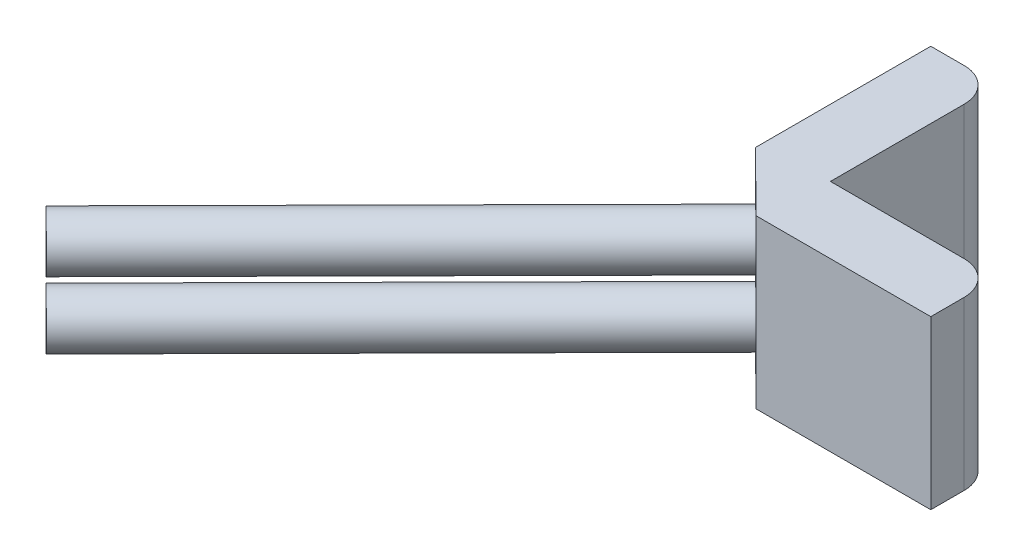
ISO-10303-21;
HEADER;
FILE_DESCRIPTION(('STEP AP214'),'2;1');
FILE_NAME('part.step','',(''),(''),'','','');
FILE_SCHEMA(('AUTOMOTIVE_DESIGN { 1 0 10303 214 1 1 1 1 }'));
ENDSEC;
DATA;
#1=APPLICATION_CONTEXT('core data for automotive mechanical design processes');
#2=APPLICATION_PROTOCOL_DEFINITION('international standard','automotive_design',2000,#1);
#3=PRODUCT_CONTEXT('',#1,'mechanical');
#4=PRODUCT('Part','Part','',(#3));
#5=PRODUCT_RELATED_PRODUCT_CATEGORY('part','',(#4));
#6=PRODUCT_DEFINITION_FORMATION('','',#4);
#7=PRODUCT_DEFINITION_CONTEXT('part definition',#1,'design');
#8=PRODUCT_DEFINITION('design','',#6,#7);
#9=PRODUCT_DEFINITION_SHAPE('','',#8);
#10=(LENGTH_UNIT() NAMED_UNIT(*) SI_UNIT(.MILLI.,.METRE.));
#11=(NAMED_UNIT(*) PLANE_ANGLE_UNIT() SI_UNIT($,.RADIAN.));
#12=(NAMED_UNIT(*) SI_UNIT($,.STERADIAN.) SOLID_ANGLE_UNIT());
#13=UNCERTAINTY_MEASURE_WITH_UNIT(LENGTH_MEASURE(1.E-05),#10,'distance_accuracy_value','');
#14=(GEOMETRIC_REPRESENTATION_CONTEXT(3) GLOBAL_UNCERTAINTY_ASSIGNED_CONTEXT((#13)) GLOBAL_UNIT_ASSIGNED_CONTEXT((#10,
#11,#12)) REPRESENTATION_CONTEXT('',''));
#15=CARTESIAN_POINT('',(0.,0.,0.));
#16=DIRECTION('',(0.,0.,1.));
#17=DIRECTION('',(1.,0.,0.));
#18=AXIS2_PLACEMENT_3D('',#15,#16,#17);
#19=CARTESIAN_POINT('',(70.,50.,0.));
#20=DIRECTION('',(0.,0.,-1.));
#21=DIRECTION('',(-1.,0.,0.));
#22=AXIS2_PLACEMENT_3D('',#19,#20,#21);
#23=PLANE('',#22);
#24=DIRECTION('',(1.,0.,0.));
#25=VECTOR('',#24,1.);
#26=CARTESIAN_POINT('',(70.,50.,0.));
#27=LINE('',#26,#25);
#28=CARTESIAN_POINT('',(17.7549992959729,50.,0.));
#29=VERTEX_POINT('',#28);
#30=CARTESIAN_POINT('',(70.,50.,0.));
#31=VERTEX_POINT('',#30);
#32=EDGE_CURVE('E135',#29,#31,#27,.T.);
#33=ORIENTED_EDGE('',*,*,#32,.F.);
#34=DIRECTION('',(0.,1.,0.));
#35=VECTOR('',#34,1.);
#36=CARTESIAN_POINT('',(17.7549992959729,0.,0.));
#37=LINE('',#36,#35);
#38=CARTESIAN_POINT('',(17.7549992959729,0.,0.));
#39=VERTEX_POINT('',#38);
#40=EDGE_CURVE('E119',#39,#29,#37,.T.);
#41=ORIENTED_EDGE('',*,*,#40,.F.);
#42=DIRECTION('',(1.,0.,0.));
#43=VECTOR('',#42,1.);
#44=CARTESIAN_POINT('',(70.,0.,0.));
#45=LINE('',#44,#43);
#46=CARTESIAN_POINT('',(70.,0.,0.));
#47=VERTEX_POINT('',#46);
#48=EDGE_CURVE('E133',#39,#47,#45,.T.);
#49=ORIENTED_EDGE('',*,*,#48,.T.);
#50=DIRECTION('',(0.,-1.,0.));
#51=VECTOR('',#50,1.);
#52=CARTESIAN_POINT('',(70.,50.,0.));
#53=LINE('',#52,#51);
#54=EDGE_CURVE('E173',#31,#47,#53,.T.);
#55=ORIENTED_EDGE('',*,*,#54,.F.);
#56=EDGE_LOOP('',(#33,#41,#49,#55));
#57=FACE_BOUND('',#56,.T.);
#58=ADVANCED_FACE('F45',(#57),#23,.F.);
#59=CARTESIAN_POINT('',(70.,50.,-20.));
#60=DIRECTION('',(-1.,0.,0.));
#61=DIRECTION('',(0.,0.,1.));
#62=AXIS2_PLACEMENT_3D('',#59,#60,#61);
#63=PLANE('',#62);
#64=DIRECTION('',(0.,0.,-1.));
#65=VECTOR('',#64,1.);
#66=CARTESIAN_POINT('',(70.,0.,-20.));
#67=LINE('',#66,#65);
#68=CARTESIAN_POINT('',(70.,0.,-10.));
#69=VERTEX_POINT('',#68);
#70=EDGE_CURVE('E140',#47,#69,#67,.T.);
#71=ORIENTED_EDGE('',*,*,#70,.T.);
#72=DIRECTION('',(0.,-1.,0.));
#73=VECTOR('',#72,1.);
#74=CARTESIAN_POINT('',(70.,50.,-10.));
#75=LINE('',#74,#73);
#76=CARTESIAN_POINT('',(70.,50.,-10.));
#77=VERTEX_POINT('',#76);
#78=EDGE_CURVE('E11',#69,#77,#75,.F.);
#79=ORIENTED_EDGE('',*,*,#78,.T.);
#80=DIRECTION('',(0.,0.,-1.));
#81=VECTOR('',#80,1.);
#82=CARTESIAN_POINT('',(70.,50.,-20.));
#83=LINE('',#82,#81);
#84=EDGE_CURVE('E233',#31,#77,#83,.T.);
#85=ORIENTED_EDGE('',*,*,#84,.F.);
#86=ORIENTED_EDGE('',*,*,#54,.T.);
#87=EDGE_LOOP('',(#71,#79,#85,#86));
#88=FACE_BOUND('',#87,.T.);
#89=ADVANCED_FACE('F277',(#88),#63,.F.);
#90=CARTESIAN_POINT('',(20.,50.,-20.));
#91=DIRECTION('',(0.,0.,1.));
#92=DIRECTION('',(1.,0.,0.));
#93=AXIS2_PLACEMENT_3D('',#90,#91,#92);
#94=PLANE('',#93);
#95=DIRECTION('',(-1.,0.,0.));
#96=VECTOR('',#95,1.);
#97=CARTESIAN_POINT('',(20.,50.,-20.));
#98=LINE('',#97,#96);
#99=CARTESIAN_POINT('',(60.,50.,-20.));
#100=VERTEX_POINT('',#99);
#101=CARTESIAN_POINT('',(20.,50.,-20.));
#102=VERTEX_POINT('',#101);
#103=EDGE_CURVE('E205',#100,#102,#98,.T.);
#104=ORIENTED_EDGE('',*,*,#103,.F.);
#105=DIRECTION('',(0.,-1.,0.));
#106=VECTOR('',#105,1.);
#107=CARTESIAN_POINT('',(60.,50.,-20.));
#108=LINE('',#107,#106);
#109=CARTESIAN_POINT('',(60.,0.,-20.));
#110=VERTEX_POINT('',#109);
#111=EDGE_CURVE('E54',#100,#110,#108,.T.);
#112=ORIENTED_EDGE('',*,*,#111,.T.);
#113=DIRECTION('',(-1.,0.,0.));
#114=VECTOR('',#113,1.);
#115=CARTESIAN_POINT('',(20.,0.,-20.));
#116=LINE('',#115,#114);
#117=CARTESIAN_POINT('',(20.,0.,-20.));
#118=VERTEX_POINT('',#117);
#119=EDGE_CURVE('E146',#110,#118,#116,.T.);
#120=ORIENTED_EDGE('',*,*,#119,.T.);
#121=DIRECTION('',(0.,-1.,0.));
#122=VECTOR('',#121,1.);
#123=CARTESIAN_POINT('',(20.,50.,-20.));
#124=LINE('',#123,#122);
#125=EDGE_CURVE('E169',#102,#118,#124,.T.);
#126=ORIENTED_EDGE('',*,*,#125,.F.);
#127=EDGE_LOOP('',(#104,#112,#120,#126));
#128=FACE_BOUND('',#127,.T.);
#129=ADVANCED_FACE('F203',(#128),#94,.F.);
#130=CARTESIAN_POINT('',(20.,50.,-70.));
#131=DIRECTION('',(-1.,0.,0.));
#132=DIRECTION('',(0.,0.,1.));
#133=AXIS2_PLACEMENT_3D('',#130,#131,#132);
#134=PLANE('',#133);
#135=DIRECTION('',(0.,0.,-1.));
#136=VECTOR('',#135,1.);
#137=CARTESIAN_POINT('',(20.,0.,-70.));
#138=LINE('',#137,#136);
#139=CARTESIAN_POINT('',(20.,0.,-60.));
#140=VERTEX_POINT('',#139);
#141=EDGE_CURVE('E155',#118,#140,#138,.T.);
#142=ORIENTED_EDGE('',*,*,#141,.T.);
#143=DIRECTION('',(0.,-1.,0.));
#144=VECTOR('',#143,1.);
#145=CARTESIAN_POINT('',(20.,50.,-60.));
#146=LINE('',#145,#144);
#147=CARTESIAN_POINT('',(20.,50.,-60.));
#148=VERTEX_POINT('',#147);
#149=EDGE_CURVE('E191',#140,#148,#146,.F.);
#150=ORIENTED_EDGE('',*,*,#149,.T.);
#151=DIRECTION('',(0.,0.,-1.));
#152=VECTOR('',#151,1.);
#153=CARTESIAN_POINT('',(20.,50.,-70.));
#154=LINE('',#153,#152);
#155=EDGE_CURVE('E222',#102,#148,#154,.T.);
#156=ORIENTED_EDGE('',*,*,#155,.F.);
#157=ORIENTED_EDGE('',*,*,#125,.T.);
#158=EDGE_LOOP('',(#142,#150,#156,#157));
#159=FACE_BOUND('',#158,.T.);
#160=ADVANCED_FACE('F210',(#159),#134,.F.);
#161=CARTESIAN_POINT('',(0.,50.,-70.));
#162=DIRECTION('',(0.,0.,1.));
#163=DIRECTION('',(1.,0.,0.));
#164=AXIS2_PLACEMENT_3D('',#161,#162,#163);
#165=PLANE('',#164);
#166=DIRECTION('',(-1.,0.,0.));
#167=VECTOR('',#166,1.);
#168=CARTESIAN_POINT('',(0.,50.,-70.));
#169=LINE('',#168,#167);
#170=CARTESIAN_POINT('',(9.99999999999999,50.,-70.));
#171=VERTEX_POINT('',#170);
#172=CARTESIAN_POINT('',(0.,50.,-70.));
#173=VERTEX_POINT('',#172);
#174=EDGE_CURVE('E220',#171,#173,#169,.T.);
#175=ORIENTED_EDGE('',*,*,#174,.F.);
#176=DIRECTION('',(0.,-1.,0.));
#177=VECTOR('',#176,1.);
#178=CARTESIAN_POINT('',(9.99999999999999,50.,-70.));
#179=LINE('',#178,#177);
#180=CARTESIAN_POINT('',(9.99999999999999,0.,-70.));
#181=VERTEX_POINT('',#180);
#182=EDGE_CURVE('E181',#171,#181,#179,.T.);
#183=ORIENTED_EDGE('',*,*,#182,.T.);
#184=DIRECTION('',(-1.,0.,0.));
#185=VECTOR('',#184,1.);
#186=CARTESIAN_POINT('',(0.,0.,-70.));
#187=LINE('',#186,#185);
#188=CARTESIAN_POINT('',(0.,0.,-70.));
#189=VERTEX_POINT('',#188);
#190=EDGE_CURVE('E159',#181,#189,#187,.T.);
#191=ORIENTED_EDGE('',*,*,#190,.T.);
#192=DIRECTION('',(0.,-1.,0.));
#193=VECTOR('',#192,1.);
#194=CARTESIAN_POINT('',(0.,50.,-70.));
#195=LINE('',#194,#193);
#196=EDGE_CURVE('E165',#173,#189,#195,.T.);
#197=ORIENTED_EDGE('',*,*,#196,.F.);
#198=EDGE_LOOP('',(#175,#183,#191,#197));
#199=FACE_BOUND('',#198,.T.);
#200=ADVANCED_FACE('F224',(#199),#165,.F.);
#201=CARTESIAN_POINT('',(0.,50.,0.));
#202=DIRECTION('',(1.,0.,0.));
#203=DIRECTION('',(0.,0.,-1.));
#204=AXIS2_PLACEMENT_3D('',#201,#202,#203);
#205=PLANE('',#204);
#206=DIRECTION('',(0.,0.,1.));
#207=VECTOR('',#206,1.);
#208=CARTESIAN_POINT('',(0.,0.,0.));
#209=LINE('',#208,#207);
#210=CARTESIAN_POINT('',(0.,0.,-17.6));
#211=VERTEX_POINT('',#210);
#212=EDGE_CURVE('E162',#189,#211,#209,.T.);
#213=ORIENTED_EDGE('',*,*,#212,.T.);
#214=DIRECTION('',(0.,1.,0.));
#215=VECTOR('',#214,1.);
#216=CARTESIAN_POINT('',(0.,0.,-17.6));
#217=LINE('',#216,#215);
#218=CARTESIAN_POINT('',(0.,50.,-17.6));
#219=VERTEX_POINT('',#218);
#220=EDGE_CURVE('E122',#211,#219,#217,.T.);
#221=ORIENTED_EDGE('',*,*,#220,.T.);
#222=DIRECTION('',(0.,0.,1.));
#223=VECTOR('',#222,1.);
#224=CARTESIAN_POINT('',(0.,50.,0.));
#225=LINE('',#224,#223);
#226=EDGE_CURVE('E150',#173,#219,#225,.T.);
#227=ORIENTED_EDGE('',*,*,#226,.F.);
#228=ORIENTED_EDGE('',*,*,#196,.T.);
#229=EDGE_LOOP('',(#213,#221,#227,#228));
#230=FACE_BOUND('',#229,.T.);
#231=ADVANCED_FACE('F321',(#230),#205,.F.);
#232=CARTESIAN_POINT('',(0.,50.,0.));
#233=DIRECTION('',(0.,-1.,0.));
#234=DIRECTION('',(0.,0.,-1.));
#235=AXIS2_PLACEMENT_3D('',#232,#233,#234);
#236=PLANE('',#235);
#237=ORIENTED_EDGE('',*,*,#155,.T.);
#238=CARTESIAN_POINT('',(9.99999999999999,50.,-60.));
#239=DIRECTION('',(0.,-1.,0.));
#240=DIRECTION('',(0.,0.,-1.));
#241=AXIS2_PLACEMENT_3D('',#238,#239,#240);
#242=CIRCLE('',#241,10.);
#243=EDGE_CURVE('E196',#148,#171,#242,.F.);
#244=ORIENTED_EDGE('',*,*,#243,.T.);
#245=ORIENTED_EDGE('',*,*,#174,.T.);
#246=ORIENTED_EDGE('',*,*,#226,.T.);
#247=DIRECTION('',(-0.710199971838918,0.,-0.704));
#248=VECTOR('',#247,1.);
#249=CARTESIAN_POINT('',(0.,50.,-17.6));
#250=LINE('',#249,#248);
#251=EDGE_CURVE('E128',#29,#219,#250,.T.);
#252=ORIENTED_EDGE('',*,*,#251,.F.);
#253=ORIENTED_EDGE('',*,*,#32,.T.);
#254=ORIENTED_EDGE('',*,*,#84,.T.);
#255=CARTESIAN_POINT('',(60.,50.,-10.));
#256=DIRECTION('',(0.,-1.,0.));
#257=DIRECTION('',(0.,0.,-1.));
#258=AXIS2_PLACEMENT_3D('',#255,#256,#257);
#259=CIRCLE('',#258,10.);
#260=EDGE_CURVE('E61',#77,#100,#259,.F.);
#261=ORIENTED_EDGE('',*,*,#260,.T.);
#262=ORIENTED_EDGE('',*,*,#103,.T.);
#263=EDGE_LOOP('',(#237,#244,#245,#246,#252,#253,#254,#261,#262));
#264=FACE_BOUND('',#263,.T.);
#265=ADVANCED_FACE('F218',(#264),#236,.F.);
#266=CARTESIAN_POINT('',(0.,0.,0.));
#267=DIRECTION('',(0.,-1.,0.));
#268=DIRECTION('',(0.,0.,-1.));
#269=AXIS2_PLACEMENT_3D('',#266,#267,#268);
#270=PLANE('',#269);
#271=ORIENTED_EDGE('',*,*,#190,.F.);
#272=CARTESIAN_POINT('',(9.99999999999999,0.,-60.));
#273=DIRECTION('',(0.,-1.,0.));
#274=DIRECTION('',(0.,0.,-1.));
#275=AXIS2_PLACEMENT_3D('',#272,#273,#274);
#276=CIRCLE('',#275,10.);
#277=EDGE_CURVE('E188',#181,#140,#276,.T.);
#278=ORIENTED_EDGE('',*,*,#277,.T.);
#279=ORIENTED_EDGE('',*,*,#141,.F.);
#280=ORIENTED_EDGE('',*,*,#119,.F.);
#281=CARTESIAN_POINT('',(60.,0.,-10.));
#282=DIRECTION('',(0.,-1.,0.));
#283=DIRECTION('',(0.,0.,-1.));
#284=AXIS2_PLACEMENT_3D('',#281,#282,#283);
#285=CIRCLE('',#284,10.);
#286=EDGE_CURVE('E185',#110,#69,#285,.T.);
#287=ORIENTED_EDGE('',*,*,#286,.T.);
#288=ORIENTED_EDGE('',*,*,#70,.F.);
#289=ORIENTED_EDGE('',*,*,#48,.F.);
#290=DIRECTION('',(-0.710199971838918,0.,-0.704));
#291=VECTOR('',#290,1.);
#292=CARTESIAN_POINT('',(0.,0.,-17.6));
#293=LINE('',#292,#291);
#294=EDGE_CURVE('E116',#39,#211,#293,.T.);
#295=ORIENTED_EDGE('',*,*,#294,.T.);
#296=ORIENTED_EDGE('',*,*,#212,.F.);
#297=EDGE_LOOP('',(#271,#278,#279,#280,#287,#288,#289,#295,#296));
#298=FACE_BOUND('',#297,.T.);
#299=ADVANCED_FACE('F139',(#298),#270,.T.);
#300=CARTESIAN_POINT('',(0.,0.,-17.6));
#301=DIRECTION('',(0.704,0.,-0.710199971838918));
#302=DIRECTION('',(-0.710199971838918,0.,-0.704));
#303=AXIS2_PLACEMENT_3D('',#300,#301,#302);
#304=PLANE('',#303);
#305=CARTESIAN_POINT('',(8.87749964798646,35.,-8.8));
#306=DIRECTION('',(-0.704,0.,0.710199971838918));
#307=DIRECTION('',(0.710199971838918,0.,0.704));
#308=AXIS2_PLACEMENT_3D('',#305,#306,#307);
#309=CIRCLE('',#308,7.5);
#310=CARTESIAN_POINT('',(14.2039994367783,35.,-3.52));
#311=VERTEX_POINT('',#310);
#312=EDGE_CURVE('E180',#311,#311,#309,.T.);
#313=ORIENTED_EDGE('',*,*,#312,.F.);
#314=EDGE_LOOP('',(#313));
#315=FACE_BOUND('',#314,.T.);
#316=CARTESIAN_POINT('',(8.87749964798648,15.,-8.80000000000002));
#317=DIRECTION('',(0.704,0.,-0.710199971838918));
#318=DIRECTION('',(-0.710199971838918,0.,-0.704));
#319=AXIS2_PLACEMENT_3D('',#316,#317,#318);
#320=CIRCLE('',#319,7.5);
#321=CARTESIAN_POINT('',(3.5509998591946,15.,-14.08));
#322=VERTEX_POINT('',#321);
#323=EDGE_CURVE('E176',#322,#322,#320,.F.);
#324=ORIENTED_EDGE('',*,*,#323,.F.);
#325=EDGE_LOOP('',(#324));
#326=FACE_BOUND('',#325,.T.);
#327=ORIENTED_EDGE('',*,*,#251,.T.);
#328=ORIENTED_EDGE('',*,*,#220,.F.);
#329=ORIENTED_EDGE('',*,*,#294,.F.);
#330=ORIENTED_EDGE('',*,*,#40,.T.);
#331=EDGE_LOOP('',(#327,#328,#329,#330));
#332=FACE_BOUND('',#331,.T.);
#333=ADVANCED_FACE('F118',(#315,#326,#332),#304,.F.);
#334=CARTESIAN_POINT('',(-96.7225003520135,15.,97.7299957758377));
#335=DIRECTION('',(0.704,0.,-0.710199971838918));
#336=DIRECTION('',(-0.710199971838918,0.,-0.704));
#337=AXIS2_PLACEMENT_3D('',#334,#335,#336);
#338=CYLINDRICAL_SURFACE('',#337,7.5);
#339=CARTESIAN_POINT('',(-96.7225003520135,15.,97.7299957758377));
#340=DIRECTION('',(-0.704,0.,0.710199971838918));
#341=DIRECTION('',(0.710199971838918,0.,0.704));
#342=AXIS2_PLACEMENT_3D('',#339,#340,#341);
#343=CIRCLE('',#342,7.5);
#344=CARTESIAN_POINT('',(-91.3960005632217,15.,103.009995775838));
#345=VERTEX_POINT('',#344);
#346=EDGE_CURVE('E241',#345,#345,#343,.T.);
#347=ORIENTED_EDGE('',*,*,#346,.F.);
#348=EDGE_LOOP('',(#347));
#349=FACE_BOUND('',#348,.T.);
#350=ORIENTED_EDGE('',*,*,#323,.T.);
#351=EDGE_LOOP('',(#350));
#352=FACE_BOUND('',#351,.T.);
#353=ADVANCED_FACE('F263',(#349,#352),#338,.T.);
#354=CARTESIAN_POINT('',(-96.7225003520135,15.,97.7299957758377));
#355=DIRECTION('',(-0.704,0.,0.710199971838918));
#356=DIRECTION('',(0.710199971838918,0.,0.704));
#357=AXIS2_PLACEMENT_3D('',#354,#355,#356);
#358=PLANE('',#357);
#359=ORIENTED_EDGE('',*,*,#346,.T.);
#360=EDGE_LOOP('',(#359));
#361=FACE_BOUND('',#360,.T.);
#362=ADVANCED_FACE('F257',(#361),#358,.T.);
#363=CARTESIAN_POINT('',(-96.7225003520135,35.,97.7299957758377));
#364=DIRECTION('',(0.704,0.,-0.710199971838918));
#365=DIRECTION('',(-0.710199971838918,0.,-0.704));
#366=AXIS2_PLACEMENT_3D('',#363,#364,#365);
#367=CYLINDRICAL_SURFACE('',#366,7.5);
#368=CARTESIAN_POINT('',(-96.7225003520135,35.,97.7299957758377));
#369=DIRECTION('',(-0.704,0.,0.710199971838918));
#370=DIRECTION('',(0.710199971838918,0.,0.704));
#371=AXIS2_PLACEMENT_3D('',#368,#369,#370);
#372=CIRCLE('',#371,7.5);
#373=CARTESIAN_POINT('',(-91.3960005632217,35.,103.009995775838));
#374=VERTEX_POINT('',#373);
#375=EDGE_CURVE('E239',#374,#374,#372,.T.);
#376=ORIENTED_EDGE('',*,*,#375,.F.);
#377=EDGE_LOOP('',(#376));
#378=FACE_BOUND('',#377,.T.);
#379=ORIENTED_EDGE('',*,*,#312,.T.);
#380=EDGE_LOOP('',(#379));
#381=FACE_BOUND('',#380,.T.);
#382=ADVANCED_FACE('F254',(#378,#381),#367,.T.);
#383=CARTESIAN_POINT('',(-96.7225003520135,35.,97.7299957758377));
#384=DIRECTION('',(-0.704,0.,0.710199971838918));
#385=DIRECTION('',(0.710199971838918,0.,0.704));
#386=AXIS2_PLACEMENT_3D('',#383,#384,#385);
#387=PLANE('',#386);
#388=ORIENTED_EDGE('',*,*,#375,.T.);
#389=EDGE_LOOP('',(#388));
#390=FACE_BOUND('',#389,.T.);
#391=ADVANCED_FACE('F252',(#390),#387,.T.);
#392=CARTESIAN_POINT('',(9.99999999999999,50.,-60.));
#393=DIRECTION('',(0.,-1.,0.));
#394=DIRECTION('',(0.,0.,-1.));
#395=AXIS2_PLACEMENT_3D('',#392,#393,#394);
#396=CYLINDRICAL_SURFACE('',#395,10.);
#397=ORIENTED_EDGE('',*,*,#243,.F.);
#398=ORIENTED_EDGE('',*,*,#149,.F.);
#399=ORIENTED_EDGE('',*,*,#277,.F.);
#400=ORIENTED_EDGE('',*,*,#182,.F.);
#401=EDGE_LOOP('',(#397,#398,#399,#400));
#402=FACE_BOUND('',#401,.T.);
#403=ADVANCED_FACE('F215',(#402),#396,.T.);
#404=CARTESIAN_POINT('',(60.,50.,-10.));
#405=DIRECTION('',(0.,-1.,0.));
#406=DIRECTION('',(0.,0.,-1.));
#407=AXIS2_PLACEMENT_3D('',#404,#405,#406);
#408=CYLINDRICAL_SURFACE('',#407,10.);
#409=ORIENTED_EDGE('',*,*,#260,.F.);
#410=ORIENTED_EDGE('',*,*,#78,.F.);
#411=ORIENTED_EDGE('',*,*,#286,.F.);
#412=ORIENTED_EDGE('',*,*,#111,.F.);
#413=EDGE_LOOP('',(#409,#410,#411,#412));
#414=FACE_BOUND('',#413,.T.);
#415=ADVANCED_FACE('F47',(#414),#408,.T.);
#416=CLOSED_SHELL('',(#58,#89,#129,#160,#200,#231,#265,#299,#333,#353,#362,#382,#391,#403,#415));
#417=MANIFOLD_SOLID_BREP('B2',#416);
#418=ADVANCED_BREP_SHAPE_REPRESENTATION('',(#18,#417),#14);
#419=SHAPE_DEFINITION_REPRESENTATION(#9,#418);
ENDSEC;
END-ISO-10303-21;
